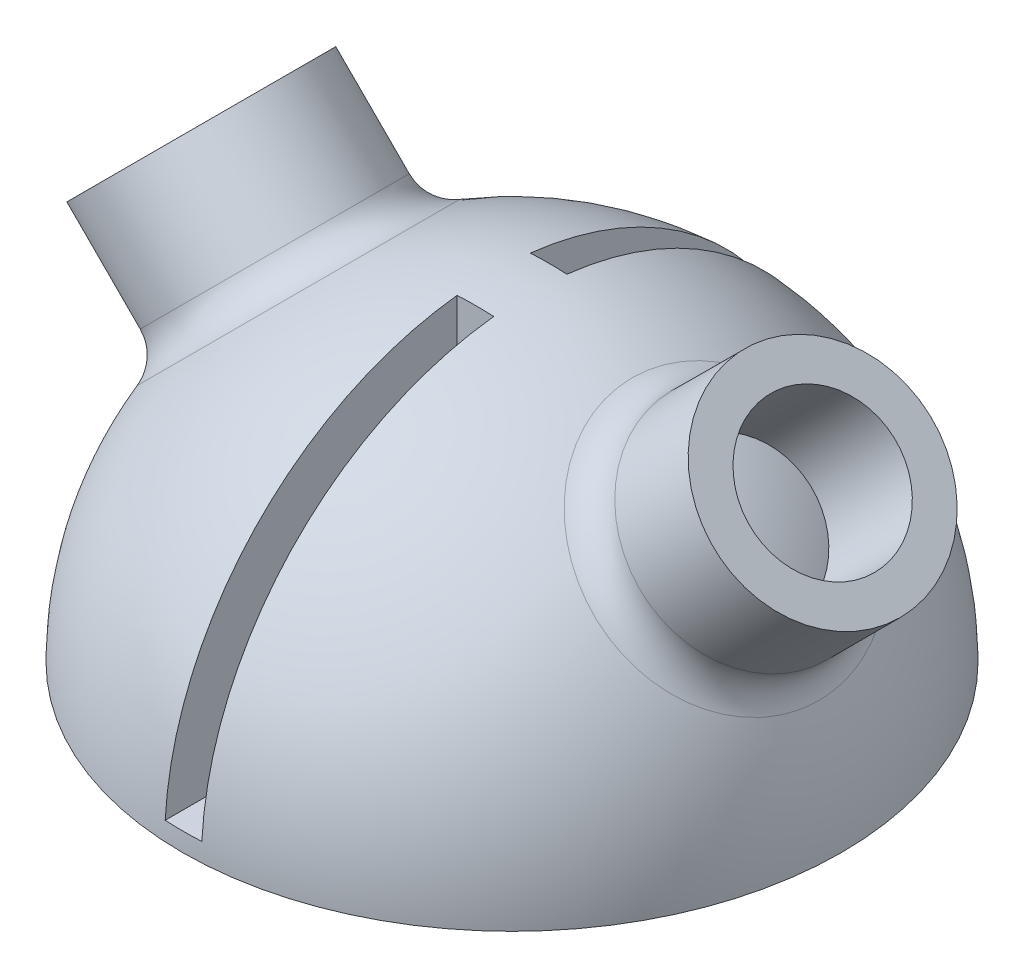
ISO-10303-21;
HEADER;
FILE_DESCRIPTION(('STEP AP214'),'2;1');
FILE_NAME('part.step','',(''),(''),'','','');
FILE_SCHEMA(('AUTOMOTIVE_DESIGN { 1 0 10303 214 1 1 1 1 }'));
ENDSEC;
DATA;
#1=APPLICATION_CONTEXT('core data for automotive mechanical design processes');
#2=APPLICATION_PROTOCOL_DEFINITION('international standard','automotive_design',2000,#1);
#3=PRODUCT_CONTEXT('',#1,'mechanical');
#4=PRODUCT('Part','Part','',(#3));
#5=PRODUCT_RELATED_PRODUCT_CATEGORY('part','',(#4));
#6=PRODUCT_DEFINITION_FORMATION('','',#4);
#7=PRODUCT_DEFINITION_CONTEXT('part definition',#1,'design');
#8=PRODUCT_DEFINITION('design','',#6,#7);
#9=PRODUCT_DEFINITION_SHAPE('','',#8);
#10=(LENGTH_UNIT() NAMED_UNIT(*) SI_UNIT(.MILLI.,.METRE.));
#11=(NAMED_UNIT(*) PLANE_ANGLE_UNIT() SI_UNIT($,.RADIAN.));
#12=(NAMED_UNIT(*) SI_UNIT($,.STERADIAN.) SOLID_ANGLE_UNIT());
#13=UNCERTAINTY_MEASURE_WITH_UNIT(LENGTH_MEASURE(1.E-05),#10,'distance_accuracy_value','');
#14=(GEOMETRIC_REPRESENTATION_CONTEXT(3) GLOBAL_UNCERTAINTY_ASSIGNED_CONTEXT((#13)) GLOBAL_UNIT_ASSIGNED_CONTEXT((#10,
#11,#12)) REPRESENTATION_CONTEXT('',''));
#15=CARTESIAN_POINT('',(0.,0.,0.));
#16=DIRECTION('',(0.,0.,1.));
#17=DIRECTION('',(1.,0.,0.));
#18=AXIS2_PLACEMENT_3D('',#15,#16,#17);
#19=CARTESIAN_POINT('',(45.0014142135629,-45.0014142135624,0.));
#20=DIRECTION('',(-0.707106781186551,0.707106781186544,0.));
#21=DIRECTION('',(-0.707106781186544,-0.707106781186551,0.));
#22=AXIS2_PLACEMENT_3D('',#19,#20,#21);
#23=CYLINDRICAL_SURFACE('',#22,20.);
#24=CARTESIAN_POINT('',(-84.8528137423862,84.8528137423852,0.));
#25=DIRECTION('',(-0.707106781186551,0.707106781186544,0.));
#26=DIRECTION('',(-0.707106781186544,-0.707106781186551,0.));
#27=AXIS2_PLACEMENT_3D('',#24,#25,#26);
#28=CIRCLE('',#27,20.);
#29=CARTESIAN_POINT('',(-98.9949493661171,70.7106781186542,0.));
#30=VERTEX_POINT('',#29);
#31=EDGE_CURVE('E146',#30,#30,#28,.T.);
#32=ORIENTED_EDGE('',*,*,#31,.T.);
#33=EDGE_LOOP('',(#32));
#34=FACE_BOUND('',#33,.T.);
#35=CARTESIAN_POINT('',(-47.434164902526,47.4341649025254,0.));
#36=DIRECTION('',(0.707106781186552,-0.707106781186544,0.));
#37=DIRECTION('',(0.707106781186544,0.707106781186552,0.));
#38=AXIS2_PLACEMENT_3D('',#35,#36,#37);
#39=CIRCLE('',#38,20.);
#40=CARTESIAN_POINT('',(-33.2920292787951,61.5763005262565,0.));
#41=VERTEX_POINT('',#40);
#42=EDGE_CURVE('E115',#41,#41,#39,.F.);
#43=ORIENTED_EDGE('',*,*,#42,.F.);
#44=EDGE_LOOP('',(#43));
#45=FACE_BOUND('',#44,.T.);
#46=ADVANCED_FACE('F34',(#34,#45),#23,.F.);
#47=CARTESIAN_POINT('',(0.,0.,0.));
#48=DIRECTION('',(-1.,0.,0.));
#49=DIRECTION('',(0.,0.,-1.));
#50=AXIS2_PLACEMENT_3D('',#47,#48,#49);
#51=SPHERICAL_SURFACE('',#50,70.);
#52=ORIENTED_EDGE('',*,*,#42,.T.);
#53=EDGE_LOOP('',(#52));
#54=FACE_BOUND('',#53,.T.);
#55=CARTESIAN_POINT('',(0.,0.,-10.));
#56=DIRECTION('',(0.,0.,-1.));
#57=DIRECTION('',(-1.,0.,0.));
#58=AXIS2_PLACEMENT_3D('',#55,#56,#57);
#59=CIRCLE('',#58,69.2820323027551);
#60=CARTESIAN_POINT('',(5.,69.1013748054263,-10.));
#61=VERTEX_POINT('',#60);
#62=CARTESIAN_POINT('',(-4.99999999999999,69.1013748054263,-10.));
#63=VERTEX_POINT('',#62);
#64=EDGE_CURVE('E104',#61,#63,#59,.F.);
#65=ORIENTED_EDGE('',*,*,#64,.F.);
#66=CARTESIAN_POINT('',(5.,0.,0.));
#67=DIRECTION('',(-1.,0.,0.));
#68=DIRECTION('',(0.,0.,1.));
#69=AXIS2_PLACEMENT_3D('',#66,#67,#68);
#70=CIRCLE('',#69,69.8212002188447);
#71=CARTESIAN_POINT('',(5.00000000000001,5.,-69.6419413859206));
#72=VERTEX_POINT('',#71);
#73=EDGE_CURVE('E110',#72,#61,#70,.F.);
#74=ORIENTED_EDGE('',*,*,#73,.F.);
#75=CARTESIAN_POINT('',(0.,5.,0.));
#76=DIRECTION('',(0.,1.,0.));
#77=DIRECTION('',(0.,0.,1.));
#78=AXIS2_PLACEMENT_3D('',#75,#76,#77);
#79=CIRCLE('',#78,69.8212002188447);
#80=CARTESIAN_POINT('',(-4.99999999999999,5.,-69.6419413859206));
#81=VERTEX_POINT('',#80);
#82=EDGE_CURVE('E96',#81,#72,#79,.F.);
#83=ORIENTED_EDGE('',*,*,#82,.F.);
#84=CARTESIAN_POINT('',(-4.99999999999999,0.,0.));
#85=DIRECTION('',(1.,0.,0.));
#86=DIRECTION('',(0.,0.,-1.));
#87=AXIS2_PLACEMENT_3D('',#84,#85,#86);
#88=CIRCLE('',#87,69.8212002188447);
#89=EDGE_CURVE('E121',#63,#81,#88,.F.);
#90=ORIENTED_EDGE('',*,*,#89,.F.);
#91=EDGE_LOOP('',(#65,#74,#83,#90));
#92=FACE_BOUND('',#91,.T.);
#93=CARTESIAN_POINT('',(0.,0.,0.));
#94=DIRECTION('',(0.,1.,0.));
#95=DIRECTION('',(1.,0.,0.));
#96=AXIS2_PLACEMENT_3D('',#93,#94,#95);
#97=CIRCLE('',#96,70.);
#98=CARTESIAN_POINT('',(70.,0.,0.));
#99=VERTEX_POINT('',#98);
#100=EDGE_CURVE('E152',#99,#99,#97,.T.);
#101=ORIENTED_EDGE('',*,*,#100,.F.);
#102=EDGE_LOOP('',(#101));
#103=FACE_BOUND('',#102,.T.);
#104=CARTESIAN_POINT('',(0.,0.,10.));
#105=DIRECTION('',(0.,0.,1.));
#106=DIRECTION('',(1.,0.,0.));
#107=AXIS2_PLACEMENT_3D('',#104,#105,#106);
#108=CIRCLE('',#107,69.2820323027551);
#109=CARTESIAN_POINT('',(-4.99999999999999,69.1013748054263,10.));
#110=VERTEX_POINT('',#109);
#111=CARTESIAN_POINT('',(5.,69.1013748054263,10.));
#112=VERTEX_POINT('',#111);
#113=EDGE_CURVE('E124',#110,#112,#108,.F.);
#114=ORIENTED_EDGE('',*,*,#113,.F.);
#115=CARTESIAN_POINT('',(-4.99999999999999,0.,0.));
#116=DIRECTION('',(1.,0.,0.));
#117=DIRECTION('',(0.,0.,-1.));
#118=AXIS2_PLACEMENT_3D('',#115,#116,#117);
#119=CIRCLE('',#118,69.8212002188447);
#120=CARTESIAN_POINT('',(-4.99999999999999,5.,69.6419413859206));
#121=VERTEX_POINT('',#120);
#122=EDGE_CURVE('E132',#121,#110,#119,.F.);
#123=ORIENTED_EDGE('',*,*,#122,.F.);
#124=CARTESIAN_POINT('',(0.,5.,0.));
#125=DIRECTION('',(0.,-1.,0.));
#126=DIRECTION('',(0.,0.,-1.));
#127=AXIS2_PLACEMENT_3D('',#124,#125,#126);
#128=CIRCLE('',#127,69.8212002188447);
#129=CARTESIAN_POINT('',(5.00000000000001,5.,69.6419413859206));
#130=VERTEX_POINT('',#129);
#131=EDGE_CURVE('E120',#121,#130,#128,.F.);
#132=ORIENTED_EDGE('',*,*,#131,.T.);
#133=CARTESIAN_POINT('',(5.,0.,0.));
#134=DIRECTION('',(-1.,0.,0.));
#135=DIRECTION('',(0.,0.,1.));
#136=AXIS2_PLACEMENT_3D('',#133,#134,#135);
#137=CIRCLE('',#136,69.8212002188447);
#138=EDGE_CURVE('E130',#112,#130,#137,.F.);
#139=ORIENTED_EDGE('',*,*,#138,.F.);
#140=EDGE_LOOP('',(#114,#123,#132,#139));
#141=FACE_BOUND('',#140,.T.);
#142=ADVANCED_FACE('F118',(#54,#92,#103,#141),#51,.F.);
#143=CARTESIAN_POINT('',(0.,0.,0.));
#144=DIRECTION('',(-1.,0.,0.));
#145=DIRECTION('',(0.,0.,1.));
#146=AXIS2_PLACEMENT_3D('',#143,#144,#145);
#147=SPHERICAL_SURFACE('',#146,90.);
#148=CARTESIAN_POINT('',(0.,0.,-10.));
#149=DIRECTION('',(0.,0.,-1.));
#150=DIRECTION('',(-1.,0.,0.));
#151=AXIS2_PLACEMENT_3D('',#148,#149,#150);
#152=CIRCLE('',#151,89.4427190999916);
#153=CARTESIAN_POINT('',(-4.99999999999999,89.3028554974588,-10.));
#154=VERTEX_POINT('',#153);
#155=CARTESIAN_POINT('',(5.,89.3028554974588,-10.));
#156=VERTEX_POINT('',#155);
#157=EDGE_CURVE('E172',#154,#156,#152,.T.);
#158=ORIENTED_EDGE('',*,*,#157,.F.);
#159=CARTESIAN_POINT('',(-4.99999999999999,0.,0.));
#160=DIRECTION('',(1.,0.,0.));
#161=DIRECTION('',(0.,0.,-1.));
#162=AXIS2_PLACEMENT_3D('',#159,#160,#161);
#163=CIRCLE('',#162,89.8610037780571);
#164=CARTESIAN_POINT('',(-4.99999999999999,5.,-89.7217922246318));
#165=VERTEX_POINT('',#164);
#166=EDGE_CURVE('E169',#165,#154,#163,.T.);
#167=ORIENTED_EDGE('',*,*,#166,.F.);
#168=CARTESIAN_POINT('',(0.,5.,0.));
#169=DIRECTION('',(0.,1.,0.));
#170=DIRECTION('',(0.,0.,1.));
#171=AXIS2_PLACEMENT_3D('',#168,#169,#170);
#172=CIRCLE('',#171,89.8610037780571);
#173=CARTESIAN_POINT('',(5.00000000000001,5.,-89.7217922246318));
#174=VERTEX_POINT('',#173);
#175=EDGE_CURVE('E167',#174,#165,#172,.T.);
#176=ORIENTED_EDGE('',*,*,#175,.F.);
#177=CARTESIAN_POINT('',(5.,0.,0.));
#178=DIRECTION('',(-1.,0.,0.));
#179=DIRECTION('',(0.,0.,1.));
#180=AXIS2_PLACEMENT_3D('',#177,#178,#179);
#181=CIRCLE('',#180,89.8610037780571);
#182=EDGE_CURVE('E113',#156,#174,#181,.T.);
#183=ORIENTED_EDGE('',*,*,#182,.F.);
#184=EDGE_LOOP('',(#158,#167,#176,#183));
#185=FACE_BOUND('',#184,.T.);
#186=CARTESIAN_POINT('',(58.3266662856711,58.3266662856704,0.));
#187=DIRECTION('',(0.707106781186551,0.707106781186544,0.));
#188=DIRECTION('',(-0.707106781186544,0.707106781186551,0.));
#189=AXIS2_PLACEMENT_3D('',#186,#187,#188);
#190=CIRCLE('',#189,36.);
#191=CARTESIAN_POINT('',(32.8708221629555,83.7825104083863,0.));
#192=VERTEX_POINT('',#191);
#193=EDGE_CURVE('E143',#192,#192,#190,.T.);
#194=ORIENTED_EDGE('',*,*,#193,.F.);
#195=EDGE_LOOP('',(#194));
#196=FACE_BOUND('',#195,.T.);
#197=CARTESIAN_POINT('',(-58.3266662856711,58.3266662856704,0.));
#198=DIRECTION('',(0.707106781186551,-0.707106781186544,0.));
#199=DIRECTION('',(0.707106781186544,0.707106781186551,0.));
#200=AXIS2_PLACEMENT_3D('',#197,#198,#199);
#201=CIRCLE('',#200,36.);
#202=CARTESIAN_POINT('',(-32.8708221629555,83.7825104083863,0.));
#203=VERTEX_POINT('',#202);
#204=EDGE_CURVE('E161',#203,#203,#201,.T.);
#205=ORIENTED_EDGE('',*,*,#204,.T.);
#206=EDGE_LOOP('',(#205));
#207=FACE_BOUND('',#206,.T.);
#208=CARTESIAN_POINT('',(0.,0.,0.));
#209=DIRECTION('',(0.,-1.,0.));
#210=DIRECTION('',(1.,0.,0.));
#211=AXIS2_PLACEMENT_3D('',#208,#209,#210);
#212=CIRCLE('',#211,90.);
#213=CARTESIAN_POINT('',(90.,0.,0.));
#214=VERTEX_POINT('',#213);
#215=EDGE_CURVE('E155',#214,#214,#212,.T.);
#216=ORIENTED_EDGE('',*,*,#215,.F.);
#217=EDGE_LOOP('',(#216));
#218=FACE_BOUND('',#217,.T.);
#219=CARTESIAN_POINT('',(0.,0.,10.));
#220=DIRECTION('',(0.,0.,1.));
#221=DIRECTION('',(1.,0.,0.));
#222=AXIS2_PLACEMENT_3D('',#219,#220,#221);
#223=CIRCLE('',#222,89.4427190999916);
#224=CARTESIAN_POINT('',(5.,89.3028554974588,10.));
#225=VERTEX_POINT('',#224);
#226=CARTESIAN_POINT('',(-4.99999999999999,89.3028554974588,10.));
#227=VERTEX_POINT('',#226);
#228=EDGE_CURVE('E11',#225,#227,#223,.T.);
#229=ORIENTED_EDGE('',*,*,#228,.F.);
#230=CARTESIAN_POINT('',(5.,0.,0.));
#231=DIRECTION('',(-1.,0.,0.));
#232=DIRECTION('',(0.,0.,1.));
#233=AXIS2_PLACEMENT_3D('',#230,#231,#232);
#234=CIRCLE('',#233,89.8610037780571);
#235=CARTESIAN_POINT('',(5.00000000000001,5.,89.7217922246318));
#236=VERTEX_POINT('',#235);
#237=EDGE_CURVE('E177',#236,#225,#234,.T.);
#238=ORIENTED_EDGE('',*,*,#237,.F.);
#239=CARTESIAN_POINT('',(0.,5.,0.));
#240=DIRECTION('',(0.,-1.,0.));
#241=DIRECTION('',(0.,0.,-1.));
#242=AXIS2_PLACEMENT_3D('',#239,#240,#241);
#243=CIRCLE('',#242,89.8610037780571);
#244=CARTESIAN_POINT('',(-4.99999999999999,5.,89.7217922246318));
#245=VERTEX_POINT('',#244);
#246=EDGE_CURVE('E174',#236,#245,#243,.T.);
#247=ORIENTED_EDGE('',*,*,#246,.T.);
#248=CARTESIAN_POINT('',(-4.99999999999999,0.,0.));
#249=DIRECTION('',(1.,0.,0.));
#250=DIRECTION('',(0.,0.,-1.));
#251=AXIS2_PLACEMENT_3D('',#248,#249,#250);
#252=CIRCLE('',#251,89.8610037780571);
#253=EDGE_CURVE('E42',#227,#245,#252,.T.);
#254=ORIENTED_EDGE('',*,*,#253,.F.);
#255=EDGE_LOOP('',(#229,#238,#247,#254));
#256=FACE_BOUND('',#255,.T.);
#257=ADVANCED_FACE('F191',(#185,#196,#207,#218,#256),#147,.T.);
#258=CARTESIAN_POINT('',(0.,0.,0.));
#259=DIRECTION('',(0.,-1.,0.));
#260=DIRECTION('',(1.,0.,0.));
#261=AXIS2_PLACEMENT_3D('',#258,#259,#260);
#262=PLANE('',#261);
#263=ORIENTED_EDGE('',*,*,#100,.T.);
#264=EDGE_LOOP('',(#263));
#265=FACE_BOUND('',#264,.T.);
#266=ORIENTED_EDGE('',*,*,#215,.T.);
#267=EDGE_LOOP('',(#266));
#268=FACE_BOUND('',#267,.T.);
#269=ADVANCED_FACE('F219',(#265,#268),#262,.T.);
#270=CARTESIAN_POINT('',(45.0014142135629,-45.0014142135624,0.));
#271=DIRECTION('',(-0.707106781186551,0.707106781186544,0.));
#272=DIRECTION('',(-0.707106781186544,-0.707106781186551,0.));
#273=AXIS2_PLACEMENT_3D('',#270,#271,#272);
#274=CYLINDRICAL_SURFACE('',#273,30.);
#275=CARTESIAN_POINT('',(-64.807406984079,64.8074069840783,0.));
#276=DIRECTION('',(0.707106781186551,-0.707106781186544,0.));
#277=DIRECTION('',(0.707106781186544,0.707106781186551,0.));
#278=AXIS2_PLACEMENT_3D('',#275,#276,#277);
#279=CIRCLE('',#278,30.);
#280=CARTESIAN_POINT('',(-43.5942035484827,86.0206104196748,0.));
#281=VERTEX_POINT('',#280);
#282=EDGE_CURVE('E158',#281,#281,#279,.F.);
#283=ORIENTED_EDGE('',*,*,#282,.T.);
#284=EDGE_LOOP('',(#283));
#285=FACE_BOUND('',#284,.T.);
#286=CARTESIAN_POINT('',(-84.8528137423862,84.8528137423852,0.));
#287=DIRECTION('',(-0.707106781186551,0.707106781186544,0.));
#288=DIRECTION('',(-0.707106781186544,-0.707106781186551,0.));
#289=AXIS2_PLACEMENT_3D('',#286,#287,#288);
#290=CIRCLE('',#289,30.);
#291=CARTESIAN_POINT('',(-106.066017177982,63.6396103067887,0.));
#292=VERTEX_POINT('',#291);
#293=EDGE_CURVE('E149',#292,#292,#290,.T.);
#294=ORIENTED_EDGE('',*,*,#293,.F.);
#295=EDGE_LOOP('',(#294));
#296=FACE_BOUND('',#295,.T.);
#297=ADVANCED_FACE('F228',(#285,#296),#274,.T.);
#298=CARTESIAN_POINT('',(-84.8528137423862,84.8528137423852,0.));
#299=DIRECTION('',(-0.707106781186551,0.707106781186544,0.));
#300=DIRECTION('',(-0.707106781186544,-0.707106781186551,0.));
#301=AXIS2_PLACEMENT_3D('',#298,#299,#300);
#302=PLANE('',#301);
#303=ORIENTED_EDGE('',*,*,#293,.T.);
#304=EDGE_LOOP('',(#303));
#305=FACE_BOUND('',#304,.T.);
#306=ORIENTED_EDGE('',*,*,#31,.F.);
#307=EDGE_LOOP('',(#306));
#308=FACE_BOUND('',#307,.T.);
#309=ADVANCED_FACE('F234',(#305,#308),#302,.T.);
#310=CARTESIAN_POINT('',(-64.807406984079,64.8074069840783,0.));
#311=DIRECTION('',(0.707106781186551,-0.707106781186544,0.));
#312=DIRECTION('',(0.707106781186544,0.707106781186551,0.));
#313=AXIS2_PLACEMENT_3D('',#310,#311,#312);
#314=TOROIDAL_SURFACE('',#313,40.,10.);
#315=ORIENTED_EDGE('',*,*,#204,.F.);
#316=EDGE_LOOP('',(#315));
#317=FACE_BOUND('',#316,.T.);
#318=ORIENTED_EDGE('',*,*,#282,.F.);
#319=EDGE_LOOP('',(#318));
#320=FACE_BOUND('',#319,.T.);
#321=ADVANCED_FACE('F36',(#317,#320),#314,.F.);
#322=CARTESIAN_POINT('',(-45.0014142135629,-45.0014142135624,0.));
#323=DIRECTION('',(0.707106781186551,0.707106781186544,0.));
#324=DIRECTION('',(0.707106781186544,-0.707106781186551,0.));
#325=AXIS2_PLACEMENT_3D('',#322,#323,#324);
#326=CYLINDRICAL_SURFACE('',#325,30.);
#327=CARTESIAN_POINT('',(64.807406984079,64.8074069840783,0.));
#328=DIRECTION('',(0.707106781186551,0.707106781186544,0.));
#329=DIRECTION('',(-0.707106781186544,0.707106781186551,0.));
#330=AXIS2_PLACEMENT_3D('',#327,#328,#329);
#331=CIRCLE('',#330,30.);
#332=CARTESIAN_POINT('',(43.5942035484827,86.0206104196748,0.));
#333=VERTEX_POINT('',#332);
#334=EDGE_CURVE('E140',#333,#333,#331,.F.);
#335=ORIENTED_EDGE('',*,*,#334,.F.);
#336=EDGE_LOOP('',(#335));
#337=FACE_BOUND('',#336,.T.);
#338=CARTESIAN_POINT('',(84.8528137423862,84.8528137423852,0.));
#339=DIRECTION('',(-0.707106781186551,-0.707106781186544,0.));
#340=DIRECTION('',(0.707106781186544,-0.707106781186551,0.));
#341=AXIS2_PLACEMENT_3D('',#338,#339,#340);
#342=CIRCLE('',#341,30.);
#343=CARTESIAN_POINT('',(106.066017177982,63.6396103067887,0.));
#344=VERTEX_POINT('',#343);
#345=EDGE_CURVE('E137',#344,#344,#342,.T.);
#346=ORIENTED_EDGE('',*,*,#345,.T.);
#347=EDGE_LOOP('',(#346));
#348=FACE_BOUND('',#347,.T.);
#349=ADVANCED_FACE('F255',(#337,#348),#326,.T.);
#350=CARTESIAN_POINT('',(-45.0014142135629,-45.0014142135624,0.));
#351=DIRECTION('',(0.707106781186551,0.707106781186544,0.));
#352=DIRECTION('',(0.707106781186544,-0.707106781186551,0.));
#353=AXIS2_PLACEMENT_3D('',#350,#351,#352);
#354=CYLINDRICAL_SURFACE('',#353,20.);
#355=CARTESIAN_POINT('',(62.0483682299546,62.048368229954,0.));
#356=DIRECTION('',(-0.707106781186551,-0.707106781186544,0.));
#357=DIRECTION('',(0.707106781186544,-0.707106781186551,0.));
#358=AXIS2_PLACEMENT_3D('',#355,#356,#357);
#359=CIRCLE('',#358,20.);
#360=CARTESIAN_POINT('',(76.1905038536855,47.9062326062229,0.));
#361=VERTEX_POINT('',#360);
#362=EDGE_CURVE('E164',#361,#361,#359,.T.);
#363=ORIENTED_EDGE('',*,*,#362,.T.);
#364=EDGE_LOOP('',(#363));
#365=FACE_BOUND('',#364,.T.);
#366=CARTESIAN_POINT('',(84.8528137423862,84.8528137423852,0.));
#367=DIRECTION('',(-0.707106781186551,-0.707106781186544,0.));
#368=DIRECTION('',(0.707106781186544,-0.707106781186551,0.));
#369=AXIS2_PLACEMENT_3D('',#366,#367,#368);
#370=CIRCLE('',#369,20.);
#371=CARTESIAN_POINT('',(98.9949493661171,70.7106781186542,0.));
#372=VERTEX_POINT('',#371);
#373=EDGE_CURVE('E134',#372,#372,#370,.T.);
#374=ORIENTED_EDGE('',*,*,#373,.F.);
#375=EDGE_LOOP('',(#374));
#376=FACE_BOUND('',#375,.T.);
#377=ADVANCED_FACE('F258',(#365,#376),#354,.F.);
#378=CARTESIAN_POINT('',(84.8528137423862,84.8528137423852,0.));
#379=DIRECTION('',(0.707106781186551,0.707106781186544,0.));
#380=DIRECTION('',(0.707106781186544,-0.707106781186551,0.));
#381=AXIS2_PLACEMENT_3D('',#378,#379,#380);
#382=PLANE('',#381);
#383=ORIENTED_EDGE('',*,*,#345,.F.);
#384=EDGE_LOOP('',(#383));
#385=FACE_BOUND('',#384,.T.);
#386=ORIENTED_EDGE('',*,*,#373,.T.);
#387=EDGE_LOOP('',(#386));
#388=FACE_BOUND('',#387,.T.);
#389=ADVANCED_FACE('F253',(#385,#388),#382,.T.);
#390=CARTESIAN_POINT('',(64.807406984079,64.8074069840783,0.));
#391=DIRECTION('',(-0.707106781186551,-0.707106781186544,0.));
#392=DIRECTION('',(-0.707106781186544,0.707106781186551,0.));
#393=AXIS2_PLACEMENT_3D('',#390,#391,#392);
#394=TOROIDAL_SURFACE('',#393,40.,10.);
#395=ORIENTED_EDGE('',*,*,#193,.T.);
#396=EDGE_LOOP('',(#395));
#397=FACE_BOUND('',#396,.T.);
#398=ORIENTED_EDGE('',*,*,#334,.T.);
#399=EDGE_LOOP('',(#398));
#400=FACE_BOUND('',#399,.T.);
#401=ADVANCED_FACE('F250',(#397,#400),#394,.F.);
#402=CARTESIAN_POINT('',(0.,0.,0.));
#403=DIRECTION('',(-0.707106781186551,-0.707106781186544,0.));
#404=DIRECTION('',(0.707106781186544,-0.707106781186551,0.));
#405=AXIS2_PLACEMENT_3D('',#402,#403,#404);
#406=SPHERICAL_SURFACE('',#405,90.);
#407=ORIENTED_EDGE('',*,*,#362,.F.);
#408=EDGE_LOOP('',(#407));
#409=FACE_BOUND('',#408,.T.);
#410=ADVANCED_FACE('F220',(#409),#406,.T.);
#411=CARTESIAN_POINT('',(5.,202.,-10.));
#412=DIRECTION('',(-1.,0.,0.));
#413=DIRECTION('',(0.,0.,1.));
#414=AXIS2_PLACEMENT_3D('',#411,#412,#413);
#415=PLANE('',#414);
#416=ORIENTED_EDGE('',*,*,#73,.T.);
#417=DIRECTION('',(0.,-1.,0.));
#418=VECTOR('',#417,1.);
#419=CARTESIAN_POINT('',(5.,202.,-10.));
#420=LINE('',#419,#418);
#421=EDGE_CURVE('E206',#156,#61,#420,.T.);
#422=ORIENTED_EDGE('',*,*,#421,.F.);
#423=ORIENTED_EDGE('',*,*,#182,.T.);
#424=DIRECTION('',(0.,0.,-1.));
#425=VECTOR('',#424,1.);
#426=CARTESIAN_POINT('',(5.,5.,-10.));
#427=LINE('',#426,#425);
#428=EDGE_CURVE('E99',#72,#174,#427,.T.);
#429=ORIENTED_EDGE('',*,*,#428,.F.);
#430=EDGE_LOOP('',(#416,#422,#423,#429));
#431=FACE_BOUND('',#430,.T.);
#432=ADVANCED_FACE('F108',(#431),#415,.T.);
#433=CARTESIAN_POINT('',(-4.99999999999999,202.,-103.791980460004));
#434=DIRECTION('',(1.,0.,0.));
#435=DIRECTION('',(0.,0.,-1.));
#436=AXIS2_PLACEMENT_3D('',#433,#434,#435);
#437=PLANE('',#436);
#438=ORIENTED_EDGE('',*,*,#89,.T.);
#439=DIRECTION('',(0.,0.,1.));
#440=VECTOR('',#439,1.);
#441=CARTESIAN_POINT('',(-4.99999999999999,5.,-103.791980460004));
#442=LINE('',#441,#440);
#443=EDGE_CURVE('E57',#165,#81,#442,.T.);
#444=ORIENTED_EDGE('',*,*,#443,.F.);
#445=ORIENTED_EDGE('',*,*,#166,.T.);
#446=DIRECTION('',(0.,-1.,0.));
#447=VECTOR('',#446,1.);
#448=CARTESIAN_POINT('',(-4.99999999999999,202.,-10.));
#449=LINE('',#448,#447);
#450=EDGE_CURVE('E200',#154,#63,#449,.T.);
#451=ORIENTED_EDGE('',*,*,#450,.T.);
#452=EDGE_LOOP('',(#438,#444,#445,#451));
#453=FACE_BOUND('',#452,.T.);
#454=ADVANCED_FACE('F214',(#453),#437,.T.);
#455=CARTESIAN_POINT('',(-4.99999999999999,202.,-10.));
#456=DIRECTION('',(0.,0.,-1.));
#457=DIRECTION('',(-1.,0.,0.));
#458=AXIS2_PLACEMENT_3D('',#455,#456,#457);
#459=PLANE('',#458);
#460=ORIENTED_EDGE('',*,*,#64,.T.);
#461=ORIENTED_EDGE('',*,*,#450,.F.);
#462=ORIENTED_EDGE('',*,*,#157,.T.);
#463=ORIENTED_EDGE('',*,*,#421,.T.);
#464=EDGE_LOOP('',(#460,#461,#462,#463));
#465=FACE_BOUND('',#464,.T.);
#466=ADVANCED_FACE('F211',(#465),#459,.T.);
#467=CARTESIAN_POINT('',(0.,5.,0.));
#468=DIRECTION('',(0.,1.,0.));
#469=DIRECTION('',(0.,0.,1.));
#470=AXIS2_PLACEMENT_3D('',#467,#468,#469);
#471=PLANE('',#470);
#472=ORIENTED_EDGE('',*,*,#82,.T.);
#473=ORIENTED_EDGE('',*,*,#428,.T.);
#474=ORIENTED_EDGE('',*,*,#175,.T.);
#475=ORIENTED_EDGE('',*,*,#443,.T.);
#476=EDGE_LOOP('',(#472,#473,#474,#475));
#477=FACE_BOUND('',#476,.T.);
#478=ADVANCED_FACE('F98',(#477),#471,.T.);
#479=CARTESIAN_POINT('',(-4.99999999999999,202.,103.791980460004));
#480=DIRECTION('',(1.,0.,0.));
#481=DIRECTION('',(0.,0.,-1.));
#482=AXIS2_PLACEMENT_3D('',#479,#480,#481);
#483=PLANE('',#482);
#484=ORIENTED_EDGE('',*,*,#122,.T.);
#485=DIRECTION('',(0.,-1.,0.));
#486=VECTOR('',#485,1.);
#487=CARTESIAN_POINT('',(-4.99999999999999,202.,10.));
#488=LINE('',#487,#486);
#489=EDGE_CURVE('E187',#227,#110,#488,.T.);
#490=ORIENTED_EDGE('',*,*,#489,.F.);
#491=ORIENTED_EDGE('',*,*,#253,.T.);
#492=DIRECTION('',(0.,0.,1.));
#493=VECTOR('',#492,1.);
#494=CARTESIAN_POINT('',(-4.99999999999999,5.,103.791980460004));
#495=LINE('',#494,#493);
#496=EDGE_CURVE('E184',#121,#245,#495,.T.);
#497=ORIENTED_EDGE('',*,*,#496,.F.);
#498=EDGE_LOOP('',(#484,#490,#491,#497));
#499=FACE_BOUND('',#498,.T.);
#500=ADVANCED_FACE('F183',(#499),#483,.T.);
#501=CARTESIAN_POINT('',(5.,202.,10.));
#502=DIRECTION('',(-1.,0.,0.));
#503=DIRECTION('',(0.,0.,1.));
#504=AXIS2_PLACEMENT_3D('',#501,#502,#503);
#505=PLANE('',#504);
#506=ORIENTED_EDGE('',*,*,#138,.T.);
#507=DIRECTION('',(0.,0.,-1.));
#508=VECTOR('',#507,1.);
#509=CARTESIAN_POINT('',(5.,5.,10.));
#510=LINE('',#509,#508);
#511=EDGE_CURVE('E49',#236,#130,#510,.T.);
#512=ORIENTED_EDGE('',*,*,#511,.F.);
#513=ORIENTED_EDGE('',*,*,#237,.T.);
#514=DIRECTION('',(0.,-1.,0.));
#515=VECTOR('',#514,1.);
#516=CARTESIAN_POINT('',(5.,202.,10.));
#517=LINE('',#516,#515);
#518=EDGE_CURVE('E105',#225,#112,#517,.T.);
#519=ORIENTED_EDGE('',*,*,#518,.T.);
#520=EDGE_LOOP('',(#506,#512,#513,#519));
#521=FACE_BOUND('',#520,.T.);
#522=ADVANCED_FACE('F194',(#521),#505,.T.);
#523=CARTESIAN_POINT('',(-4.99999999999999,202.,10.));
#524=DIRECTION('',(0.,0.,1.));
#525=DIRECTION('',(1.,0.,0.));
#526=AXIS2_PLACEMENT_3D('',#523,#524,#525);
#527=PLANE('',#526);
#528=ORIENTED_EDGE('',*,*,#113,.T.);
#529=ORIENTED_EDGE('',*,*,#518,.F.);
#530=ORIENTED_EDGE('',*,*,#228,.T.);
#531=ORIENTED_EDGE('',*,*,#489,.T.);
#532=EDGE_LOOP('',(#528,#529,#530,#531));
#533=FACE_BOUND('',#532,.T.);
#534=ADVANCED_FACE('F278',(#533),#527,.T.);
#535=CARTESIAN_POINT('',(0.,5.,0.));
#536=DIRECTION('',(0.,-1.,0.));
#537=DIRECTION('',(0.,0.,-1.));
#538=AXIS2_PLACEMENT_3D('',#535,#536,#537);
#539=PLANE('',#538);
#540=ORIENTED_EDGE('',*,*,#496,.T.);
#541=ORIENTED_EDGE('',*,*,#246,.F.);
#542=ORIENTED_EDGE('',*,*,#511,.T.);
#543=ORIENTED_EDGE('',*,*,#131,.F.);
#544=EDGE_LOOP('',(#540,#541,#542,#543));
#545=FACE_BOUND('',#544,.T.);
#546=ADVANCED_FACE('F192',(#545),#539,.F.);
#547=CLOSED_SHELL('',(#46,#142,#257,#269,#297,#309,#321,#349,#377,#389,#401,#410,#432,#454,#466,
#478,#500,#522,#534,#546));
#548=MANIFOLD_SOLID_BREP('B2',#547);
#549=ADVANCED_BREP_SHAPE_REPRESENTATION('',(#18,#548),#14);
#550=SHAPE_DEFINITION_REPRESENTATION(#9,#549);
ENDSEC;
END-ISO-10303-21;
